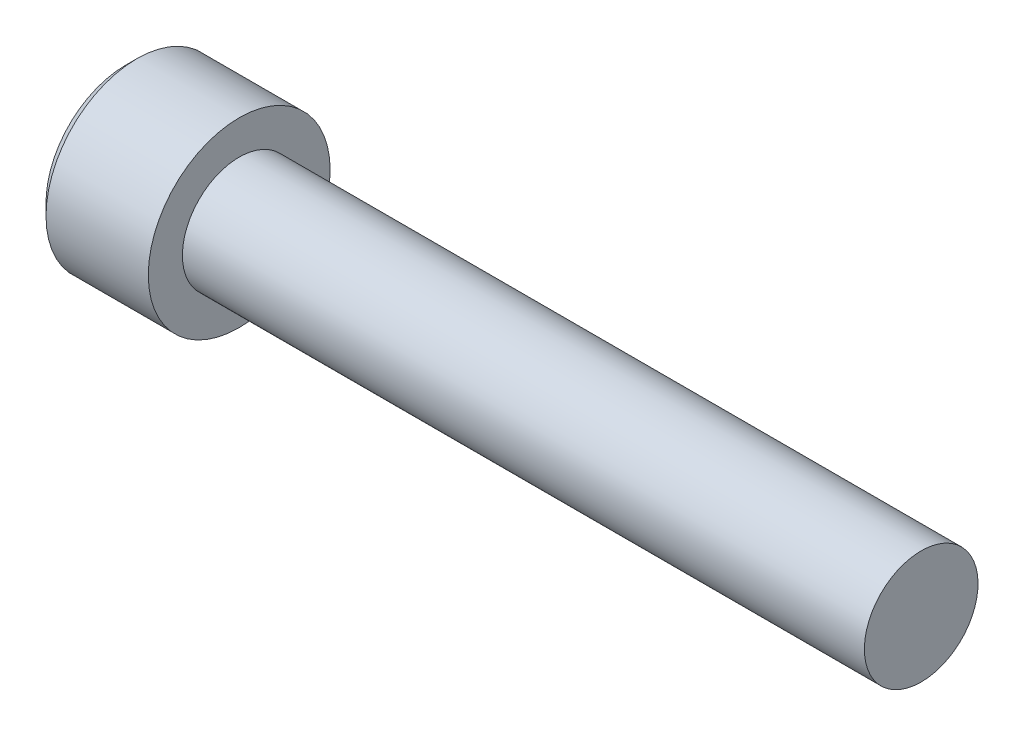
ISO-10303-21;
HEADER;
FILE_DESCRIPTION(('STEP AP214'),'2;1');
FILE_NAME('part.step','',(''),(''),'','','');
FILE_SCHEMA(('AUTOMOTIVE_DESIGN { 1 0 10303 214 1 1 1 1 }'));
ENDSEC;
DATA;
#1=APPLICATION_CONTEXT('core data for automotive mechanical design processes');
#2=APPLICATION_PROTOCOL_DEFINITION('international standard','automotive_design',2000,#1);
#3=PRODUCT_CONTEXT('',#1,'mechanical');
#4=PRODUCT('Part','Part','',(#3));
#5=PRODUCT_RELATED_PRODUCT_CATEGORY('part','',(#4));
#6=PRODUCT_DEFINITION_FORMATION('','',#4);
#7=PRODUCT_DEFINITION_CONTEXT('part definition',#1,'design');
#8=PRODUCT_DEFINITION('design','',#6,#7);
#9=PRODUCT_DEFINITION_SHAPE('','',#8);
#10=(LENGTH_UNIT() NAMED_UNIT(*) SI_UNIT(.MILLI.,.METRE.));
#11=(NAMED_UNIT(*) PLANE_ANGLE_UNIT() SI_UNIT($,.RADIAN.));
#12=(NAMED_UNIT(*) SI_UNIT($,.STERADIAN.) SOLID_ANGLE_UNIT());
#13=UNCERTAINTY_MEASURE_WITH_UNIT(LENGTH_MEASURE(1.E-05),#10,'distance_accuracy_value','');
#14=(GEOMETRIC_REPRESENTATION_CONTEXT(3) GLOBAL_UNCERTAINTY_ASSIGNED_CONTEXT((#13)) GLOBAL_UNIT_ASSIGNED_CONTEXT((#10,
#11,#12)) REPRESENTATION_CONTEXT('',''));
#15=CARTESIAN_POINT('',(0.,0.,0.));
#16=DIRECTION('',(0.,0.,1.));
#17=DIRECTION('',(1.,0.,0.));
#18=AXIS2_PLACEMENT_3D('',#15,#16,#17);
#19=CARTESIAN_POINT('',(0.,5.,0.));
#20=DIRECTION('',(-1.,0.,0.));
#21=DIRECTION('',(0.,-1.,0.));
#22=AXIS2_PLACEMENT_3D('',#19,#20,#21);
#23=PLANE('',#22);
#24=CARTESIAN_POINT('',(0.,0.,0.));
#25=DIRECTION('',(-1.,0.,0.));
#26=DIRECTION('',(0.,-1.,0.));
#27=AXIS2_PLACEMENT_3D('',#24,#25,#26);
#28=CIRCLE('',#27,8.);
#29=CARTESIAN_POINT('',(0.,-8.,0.));
#30=VERTEX_POINT('',#29);
#31=EDGE_CURVE('E191',#30,#30,#28,.T.);
#32=ORIENTED_EDGE('',*,*,#31,.F.);
#33=EDGE_LOOP('',(#32));
#34=FACE_BOUND('',#33,.T.);
#35=CARTESIAN_POINT('',(0.,0.,0.));
#36=DIRECTION('',(-1.,0.,0.));
#37=DIRECTION('',(0.,-1.,0.));
#38=AXIS2_PLACEMENT_3D('',#35,#36,#37);
#39=CIRCLE('',#38,5.);
#40=CARTESIAN_POINT('',(0.,-5.,0.));
#41=VERTEX_POINT('',#40);
#42=EDGE_CURVE('E184',#41,#41,#39,.T.);
#43=ORIENTED_EDGE('',*,*,#42,.T.);
#44=EDGE_LOOP('',(#43));
#45=FACE_BOUND('',#44,.T.);
#46=ADVANCED_FACE('F43',(#34,#45),#23,.F.);
#47=CARTESIAN_POINT('',(-10.,0.,0.));
#48=DIRECTION('',(-1.,0.,0.));
#49=DIRECTION('',(0.,-1.,0.));
#50=AXIS2_PLACEMENT_3D('',#47,#48,#49);
#51=CYLINDRICAL_SURFACE('',#50,8.);
#52=CARTESIAN_POINT('',(-8.99999999999998,0.,0.));
#53=DIRECTION('',(1.,0.,0.));
#54=DIRECTION('',(0.,1.,0.));
#55=AXIS2_PLACEMENT_3D('',#52,#53,#54);
#56=CIRCLE('',#55,8.);
#57=CARTESIAN_POINT('',(-8.99999999999998,8.,0.));
#58=VERTEX_POINT('',#57);
#59=EDGE_CURVE('E11',#58,#58,#56,.T.);
#60=ORIENTED_EDGE('',*,*,#59,.T.);
#61=EDGE_LOOP('',(#60));
#62=FACE_BOUND('',#61,.T.);
#63=ORIENTED_EDGE('',*,*,#31,.T.);
#64=EDGE_LOOP('',(#63));
#65=FACE_BOUND('',#64,.T.);
#66=ADVANCED_FACE('F210',(#62,#65),#51,.T.);
#67=CARTESIAN_POINT('',(-10.,0.,0.));
#68=DIRECTION('',(1.,0.,0.));
#69=DIRECTION('',(0.,1.,0.));
#70=AXIS2_PLACEMENT_3D('',#67,#68,#69);
#71=PLANE('',#70);
#72=CARTESIAN_POINT('',(-10.,0.,0.));
#73=DIRECTION('',(1.,0.,0.));
#74=DIRECTION('',(0.,1.,0.));
#75=AXIS2_PLACEMENT_3D('',#72,#73,#74);
#76=CIRCLE('',#75,6.99999999999999);
#77=CARTESIAN_POINT('',(-10.,6.99999999999999,0.));
#78=VERTEX_POINT('',#77);
#79=EDGE_CURVE('E51',#78,#78,#76,.F.);
#80=ORIENTED_EDGE('',*,*,#79,.T.);
#81=EDGE_LOOP('',(#80));
#82=FACE_BOUND('',#81,.T.);
#83=DIRECTION('',(0.,0.5,-0.866025403784439));
#84=VECTOR('',#83,1.);
#85=CARTESIAN_POINT('',(-10.,2.3094010767585,4.));
#86=LINE('',#85,#84);
#87=CARTESIAN_POINT('',(-10.,2.3094010767585,4.));
#88=VERTEX_POINT('',#87);
#89=CARTESIAN_POINT('',(-10.,4.61880215351701,0.));
#90=VERTEX_POINT('',#89);
#91=EDGE_CURVE('E156',#88,#90,#86,.T.);
#92=ORIENTED_EDGE('',*,*,#91,.F.);
#93=DIRECTION('',(0.,1.,0.));
#94=VECTOR('',#93,1.);
#95=CARTESIAN_POINT('',(-10.,-2.3094010767585,4.));
#96=LINE('',#95,#94);
#97=CARTESIAN_POINT('',(-10.,-2.3094010767585,4.));
#98=VERTEX_POINT('',#97);
#99=EDGE_CURVE('E58',#98,#88,#96,.T.);
#100=ORIENTED_EDGE('',*,*,#99,.F.);
#101=DIRECTION('',(0.,0.5,0.866025403784439));
#102=VECTOR('',#101,1.);
#103=CARTESIAN_POINT('',(-10.,-4.618802153517,0.));
#104=LINE('',#103,#102);
#105=CARTESIAN_POINT('',(-10.,-4.618802153517,0.));
#106=VERTEX_POINT('',#105);
#107=EDGE_CURVE('E124',#106,#98,#104,.T.);
#108=ORIENTED_EDGE('',*,*,#107,.F.);
#109=DIRECTION('',(0.,-0.5,0.866025403784439));
#110=VECTOR('',#109,1.);
#111=CARTESIAN_POINT('',(-10.,-2.3094010767585,-4.));
#112=LINE('',#111,#110);
#113=CARTESIAN_POINT('',(-10.,-2.3094010767585,-4.));
#114=VERTEX_POINT('',#113);
#115=EDGE_CURVE('E164',#114,#106,#112,.T.);
#116=ORIENTED_EDGE('',*,*,#115,.F.);
#117=DIRECTION('',(0.,-1.,0.));
#118=VECTOR('',#117,1.);
#119=CARTESIAN_POINT('',(-10.,2.3094010767585,-4.));
#120=LINE('',#119,#118);
#121=CARTESIAN_POINT('',(-10.,2.3094010767585,-4.));
#122=VERTEX_POINT('',#121);
#123=EDGE_CURVE('E161',#122,#114,#120,.T.);
#124=ORIENTED_EDGE('',*,*,#123,.F.);
#125=DIRECTION('',(0.,-0.5,-0.866025403784439));
#126=VECTOR('',#125,1.);
#127=CARTESIAN_POINT('',(-10.,4.61880215351701,0.));
#128=LINE('',#127,#126);
#129=EDGE_CURVE('E158',#90,#122,#128,.T.);
#130=ORIENTED_EDGE('',*,*,#129,.F.);
#131=EDGE_LOOP('',(#92,#100,#108,#116,#124,#130));
#132=FACE_BOUND('',#131,.T.);
#133=ADVANCED_FACE('F196',(#82,#132),#71,.F.);
#134=CARTESIAN_POINT('',(60.,5.,0.));
#135=DIRECTION('',(-1.,0.,0.));
#136=DIRECTION('',(0.,-1.,0.));
#137=AXIS2_PLACEMENT_3D('',#134,#135,#136);
#138=PLANE('',#137);
#139=CARTESIAN_POINT('',(60.,0.,0.));
#140=DIRECTION('',(-1.,0.,0.));
#141=DIRECTION('',(0.,-1.,0.));
#142=AXIS2_PLACEMENT_3D('',#139,#140,#141);
#143=CIRCLE('',#142,5.);
#144=CARTESIAN_POINT('',(60.,-5.,0.));
#145=VERTEX_POINT('',#144);
#146=EDGE_CURVE('E188',#145,#145,#143,.T.);
#147=ORIENTED_EDGE('',*,*,#146,.F.);
#148=EDGE_LOOP('',(#147));
#149=FACE_BOUND('',#148,.T.);
#150=ADVANCED_FACE('F222',(#149),#138,.F.);
#151=CARTESIAN_POINT('',(-10.,0.,0.));
#152=DIRECTION('',(-1.,0.,0.));
#153=DIRECTION('',(0.,-1.,0.));
#154=AXIS2_PLACEMENT_3D('',#151,#152,#153);
#155=CYLINDRICAL_SURFACE('',#154,5.);
#156=ORIENTED_EDGE('',*,*,#42,.F.);
#157=EDGE_LOOP('',(#156));
#158=FACE_BOUND('',#157,.T.);
#159=ORIENTED_EDGE('',*,*,#146,.T.);
#160=EDGE_LOOP('',(#159));
#161=FACE_BOUND('',#160,.T.);
#162=ADVANCED_FACE('F224',(#158,#161),#155,.T.);
#163=CARTESIAN_POINT('',(-5.,-2.3094010767585,4.));
#164=DIRECTION('',(0.,0.,1.));
#165=DIRECTION('',(0.,-1.,0.));
#166=AXIS2_PLACEMENT_3D('',#163,#164,#165);
#167=PLANE('',#166);
#168=DIRECTION('',(0.,1.,0.));
#169=VECTOR('',#168,1.);
#170=CARTESIAN_POINT('',(-5.,-2.3094010767585,4.));
#171=LINE('',#170,#169);
#172=CARTESIAN_POINT('',(-5.,-2.3094010767585,4.));
#173=VERTEX_POINT('',#172);
#174=CARTESIAN_POINT('',(-5.,0.,4.));
#175=VERTEX_POINT('',#174);
#176=EDGE_CURVE('E123',#173,#175,#171,.T.);
#177=ORIENTED_EDGE('',*,*,#176,.F.);
#178=DIRECTION('',(-1.,0.,0.));
#179=VECTOR('',#178,1.);
#180=CARTESIAN_POINT('',(-5.,-2.3094010767585,4.));
#181=LINE('',#180,#179);
#182=EDGE_CURVE('E168',#173,#98,#181,.T.);
#183=ORIENTED_EDGE('',*,*,#182,.T.);
#184=ORIENTED_EDGE('',*,*,#99,.T.);
#185=DIRECTION('',(-1.,0.,0.));
#186=VECTOR('',#185,1.);
#187=CARTESIAN_POINT('',(-5.,2.3094010767585,4.));
#188=LINE('',#187,#186);
#189=CARTESIAN_POINT('',(-5.,2.3094010767585,4.));
#190=VERTEX_POINT('',#189);
#191=EDGE_CURVE('E127',#190,#88,#188,.T.);
#192=ORIENTED_EDGE('',*,*,#191,.F.);
#193=EDGE_CURVE('E117',#175,#190,#171,.T.);
#194=ORIENTED_EDGE('',*,*,#193,.F.);
#195=EDGE_LOOP('',(#177,#183,#184,#192,#194));
#196=FACE_BOUND('',#195,.T.);
#197=ADVANCED_FACE('F128',(#196),#167,.F.);
#198=CARTESIAN_POINT('',(-5.,-4.618802153517,0.));
#199=DIRECTION('',(0.,-0.866025403784439,0.5));
#200=DIRECTION('',(0.,-0.5,-0.866025403784439));
#201=AXIS2_PLACEMENT_3D('',#198,#199,#200);
#202=PLANE('',#201);
#203=DIRECTION('',(0.,0.5,0.866025403784439));
#204=VECTOR('',#203,1.);
#205=CARTESIAN_POINT('',(-5.,-4.618802153517,0.));
#206=LINE('',#205,#204);
#207=CARTESIAN_POINT('',(-5.,-4.618802153517,0.));
#208=VERTEX_POINT('',#207);
#209=CARTESIAN_POINT('',(-5.,-3.46410161513776,2.));
#210=VERTEX_POINT('',#209);
#211=EDGE_CURVE('E132',#208,#210,#206,.T.);
#212=ORIENTED_EDGE('',*,*,#211,.F.);
#213=DIRECTION('',(-1.,0.,0.));
#214=VECTOR('',#213,1.);
#215=CARTESIAN_POINT('',(-5.,-4.618802153517,0.));
#216=LINE('',#215,#214);
#217=EDGE_CURVE('E171',#208,#106,#216,.T.);
#218=ORIENTED_EDGE('',*,*,#217,.T.);
#219=ORIENTED_EDGE('',*,*,#107,.T.);
#220=ORIENTED_EDGE('',*,*,#182,.F.);
#221=EDGE_CURVE('E152',#210,#173,#206,.T.);
#222=ORIENTED_EDGE('',*,*,#221,.F.);
#223=EDGE_LOOP('',(#212,#218,#219,#220,#222));
#224=FACE_BOUND('',#223,.T.);
#225=ADVANCED_FACE('F231',(#224),#202,.F.);
#226=CARTESIAN_POINT('',(-5.,-2.3094010767585,-4.));
#227=DIRECTION('',(0.,-0.866025403784439,-0.5));
#228=DIRECTION('',(0.,0.5,-0.866025403784439));
#229=AXIS2_PLACEMENT_3D('',#226,#227,#228);
#230=PLANE('',#229);
#231=DIRECTION('',(0.,-0.5,0.866025403784439));
#232=VECTOR('',#231,1.);
#233=CARTESIAN_POINT('',(-5.,-2.3094010767585,-4.));
#234=LINE('',#233,#232);
#235=CARTESIAN_POINT('',(-5.,-2.3094010767585,-4.));
#236=VERTEX_POINT('',#235);
#237=CARTESIAN_POINT('',(-5.,-3.46410161513775,-2.));
#238=VERTEX_POINT('',#237);
#239=EDGE_CURVE('E149',#236,#238,#234,.T.);
#240=ORIENTED_EDGE('',*,*,#239,.F.);
#241=DIRECTION('',(-1.,0.,0.));
#242=VECTOR('',#241,1.);
#243=CARTESIAN_POINT('',(-5.,-2.3094010767585,-4.));
#244=LINE('',#243,#242);
#245=EDGE_CURVE('E174',#236,#114,#244,.T.);
#246=ORIENTED_EDGE('',*,*,#245,.T.);
#247=ORIENTED_EDGE('',*,*,#115,.T.);
#248=ORIENTED_EDGE('',*,*,#217,.F.);
#249=EDGE_CURVE('E148',#238,#208,#234,.T.);
#250=ORIENTED_EDGE('',*,*,#249,.F.);
#251=EDGE_LOOP('',(#240,#246,#247,#248,#250));
#252=FACE_BOUND('',#251,.T.);
#253=ADVANCED_FACE('F242',(#252),#230,.F.);
#254=CARTESIAN_POINT('',(-5.,2.3094010767585,-4.));
#255=DIRECTION('',(0.,0.,-1.));
#256=DIRECTION('',(-1.,0.,0.));
#257=AXIS2_PLACEMENT_3D('',#254,#255,#256);
#258=PLANE('',#257);
#259=DIRECTION('',(0.,-1.,0.));
#260=VECTOR('',#259,1.);
#261=CARTESIAN_POINT('',(-5.,2.3094010767585,-4.));
#262=LINE('',#261,#260);
#263=CARTESIAN_POINT('',(-5.,2.3094010767585,-4.));
#264=VERTEX_POINT('',#263);
#265=CARTESIAN_POINT('',(-5.,0.,-4.));
#266=VERTEX_POINT('',#265);
#267=EDGE_CURVE('E145',#264,#266,#262,.T.);
#268=ORIENTED_EDGE('',*,*,#267,.F.);
#269=DIRECTION('',(-1.,0.,0.));
#270=VECTOR('',#269,1.);
#271=CARTESIAN_POINT('',(-5.,2.3094010767585,-4.));
#272=LINE('',#271,#270);
#273=EDGE_CURVE('E177',#264,#122,#272,.T.);
#274=ORIENTED_EDGE('',*,*,#273,.T.);
#275=ORIENTED_EDGE('',*,*,#123,.T.);
#276=ORIENTED_EDGE('',*,*,#245,.F.);
#277=EDGE_CURVE('E144',#266,#236,#262,.T.);
#278=ORIENTED_EDGE('',*,*,#277,.F.);
#279=EDGE_LOOP('',(#268,#274,#275,#276,#278));
#280=FACE_BOUND('',#279,.T.);
#281=ADVANCED_FACE('F238',(#280),#258,.F.);
#282=CARTESIAN_POINT('',(-5.,4.61880215351701,0.));
#283=DIRECTION('',(0.,0.866025403784439,-0.5));
#284=DIRECTION('',(0.,0.5,0.866025403784439));
#285=AXIS2_PLACEMENT_3D('',#282,#283,#284);
#286=PLANE('',#285);
#287=DIRECTION('',(0.,-0.5,-0.866025403784439));
#288=VECTOR('',#287,1.);
#289=CARTESIAN_POINT('',(-5.,4.61880215351701,0.));
#290=LINE('',#289,#288);
#291=CARTESIAN_POINT('',(-5.,4.61880215351701,0.));
#292=VERTEX_POINT('',#291);
#293=CARTESIAN_POINT('',(-5.,3.46410161513776,-2.));
#294=VERTEX_POINT('',#293);
#295=EDGE_CURVE('E140',#292,#294,#290,.T.);
#296=ORIENTED_EDGE('',*,*,#295,.F.);
#297=DIRECTION('',(-1.,0.,0.));
#298=VECTOR('',#297,1.);
#299=CARTESIAN_POINT('',(-5.,4.61880215351701,0.));
#300=LINE('',#299,#298);
#301=EDGE_CURVE('E131',#292,#90,#300,.T.);
#302=ORIENTED_EDGE('',*,*,#301,.T.);
#303=ORIENTED_EDGE('',*,*,#129,.T.);
#304=ORIENTED_EDGE('',*,*,#273,.F.);
#305=EDGE_CURVE('E138',#294,#264,#290,.T.);
#306=ORIENTED_EDGE('',*,*,#305,.F.);
#307=EDGE_LOOP('',(#296,#302,#303,#304,#306));
#308=FACE_BOUND('',#307,.T.);
#309=ADVANCED_FACE('F235',(#308),#286,.F.);
#310=CARTESIAN_POINT('',(-5.,2.3094010767585,4.));
#311=DIRECTION('',(0.,0.866025403784438,0.5));
#312=DIRECTION('',(0.,-0.5,0.866025403784439));
#313=AXIS2_PLACEMENT_3D('',#310,#311,#312);
#314=PLANE('',#313);
#315=DIRECTION('',(0.,0.5,-0.866025403784439));
#316=VECTOR('',#315,1.);
#317=CARTESIAN_POINT('',(-5.,2.3094010767585,4.));
#318=LINE('',#317,#316);
#319=CARTESIAN_POINT('',(-5.,3.46410161513775,2.));
#320=VERTEX_POINT('',#319);
#321=EDGE_CURVE('E66',#190,#320,#318,.T.);
#322=ORIENTED_EDGE('',*,*,#321,.F.);
#323=ORIENTED_EDGE('',*,*,#191,.T.);
#324=ORIENTED_EDGE('',*,*,#91,.T.);
#325=ORIENTED_EDGE('',*,*,#301,.F.);
#326=EDGE_CURVE('E136',#320,#292,#318,.T.);
#327=ORIENTED_EDGE('',*,*,#326,.F.);
#328=EDGE_LOOP('',(#322,#323,#324,#325,#327));
#329=FACE_BOUND('',#328,.T.);
#330=ADVANCED_FACE('F134',(#329),#314,.F.);
#331=CARTESIAN_POINT('',(-5.,0.,0.));
#332=DIRECTION('',(-1.,0.,0.));
#333=DIRECTION('',(0.,0.,1.));
#334=AXIS2_PLACEMENT_3D('',#331,#332,#333);
#335=PLANE('',#334);
#336=CARTESIAN_POINT('',(-5.,0.,0.));
#337=DIRECTION('',(1.,0.,0.));
#338=DIRECTION('',(0.,0.,-1.));
#339=AXIS2_PLACEMENT_3D('',#336,#337,#338);
#340=CIRCLE('',#339,4.);
#341=EDGE_CURVE('E275',#175,#210,#340,.T.);
#342=ORIENTED_EDGE('',*,*,#341,.T.);
#343=ORIENTED_EDGE('',*,*,#221,.T.);
#344=ORIENTED_EDGE('',*,*,#176,.T.);
#345=EDGE_LOOP('',(#342,#343,#344));
#346=FACE_BOUND('',#345,.T.);
#347=ADVANCED_FACE('F234',(#346),#335,.T.);
#348=EDGE_CURVE('E276',#210,#238,#340,.T.);
#349=ORIENTED_EDGE('',*,*,#348,.T.);
#350=ORIENTED_EDGE('',*,*,#249,.T.);
#351=ORIENTED_EDGE('',*,*,#211,.T.);
#352=EDGE_LOOP('',(#349,#350,#351));
#353=FACE_BOUND('',#352,.T.);
#354=ADVANCED_FACE('F251',(#353),#335,.T.);
#355=EDGE_CURVE('E170',#238,#266,#340,.T.);
#356=ORIENTED_EDGE('',*,*,#355,.T.);
#357=ORIENTED_EDGE('',*,*,#277,.T.);
#358=ORIENTED_EDGE('',*,*,#239,.T.);
#359=EDGE_LOOP('',(#356,#357,#358));
#360=FACE_BOUND('',#359,.T.);
#361=ADVANCED_FACE('F256',(#360),#335,.T.);
#362=EDGE_CURVE('E182',#266,#294,#340,.T.);
#363=ORIENTED_EDGE('',*,*,#362,.T.);
#364=ORIENTED_EDGE('',*,*,#305,.T.);
#365=ORIENTED_EDGE('',*,*,#267,.T.);
#366=EDGE_LOOP('',(#363,#364,#365));
#367=FACE_BOUND('',#366,.T.);
#368=ADVANCED_FACE('F263',(#367),#335,.T.);
#369=EDGE_CURVE('E185',#294,#320,#340,.T.);
#370=ORIENTED_EDGE('',*,*,#369,.T.);
#371=ORIENTED_EDGE('',*,*,#326,.T.);
#372=ORIENTED_EDGE('',*,*,#295,.T.);
#373=EDGE_LOOP('',(#370,#371,#372));
#374=FACE_BOUND('',#373,.T.);
#375=ADVANCED_FACE('F259',(#374),#335,.T.);
#376=EDGE_CURVE('E120',#320,#175,#340,.T.);
#377=ORIENTED_EDGE('',*,*,#376,.T.);
#378=ORIENTED_EDGE('',*,*,#193,.T.);
#379=ORIENTED_EDGE('',*,*,#321,.T.);
#380=EDGE_LOOP('',(#377,#378,#379));
#381=FACE_BOUND('',#380,.T.);
#382=ADVANCED_FACE('F118',(#381),#335,.T.);
#383=CARTESIAN_POINT('',(-2.59655752388973,0.,0.));
#384=DIRECTION('',(-1.,0.,0.));
#385=DIRECTION('',(0.,0.,1.));
#386=AXIS2_PLACEMENT_3D('',#383,#384,#385);
#387=CONICAL_SURFACE('',#386,0.,1.02974425867665);
#388=ORIENTED_EDGE('',*,*,#362,.F.);
#389=ORIENTED_EDGE('',*,*,#355,.F.);
#390=ORIENTED_EDGE('',*,*,#348,.F.);
#391=ORIENTED_EDGE('',*,*,#341,.F.);
#392=ORIENTED_EDGE('',*,*,#376,.F.);
#393=ORIENTED_EDGE('',*,*,#369,.F.);
#394=EDGE_LOOP('',(#388,#389,#390,#391,#392,#393));
#395=FACE_BOUND('',#394,.T.);
#396=CARTESIAN_POINT('',(-2.59655752388973,0.,0.));
#397=VERTEX_POINT('',#396);
#398=VERTEX_LOOP('',#397);
#399=FACE_BOUND('',#398,.T.);
#400=ADVANCED_FACE('F200',(#395,#399),#387,.F.);
#401=CARTESIAN_POINT('',(-10.,0.,0.));
#402=DIRECTION('',(1.,0.,0.));
#403=DIRECTION('',(0.,1.,0.));
#404=AXIS2_PLACEMENT_3D('',#401,#402,#403);
#405=CONICAL_SURFACE('',#404,6.99999999999999,0.785398163397445);
#406=ORIENTED_EDGE('',*,*,#59,.F.);
#407=EDGE_LOOP('',(#406));
#408=FACE_BOUND('',#407,.T.);
#409=ORIENTED_EDGE('',*,*,#79,.F.);
#410=EDGE_LOOP('',(#409));
#411=FACE_BOUND('',#410,.T.);
#412=ADVANCED_FACE('F45',(#408,#411),#405,.T.);
#413=CLOSED_SHELL('',(#46,#66,#133,#150,#162,#197,#225,#253,#281,#309,#330,#347,#354,#361,#368,
#375,#382,#400,#412));
#414=MANIFOLD_SOLID_BREP('B2',#413);
#415=ADVANCED_BREP_SHAPE_REPRESENTATION('',(#18,#414),#14);
#416=SHAPE_DEFINITION_REPRESENTATION(#9,#415);
ENDSEC;
END-ISO-10303-21;
